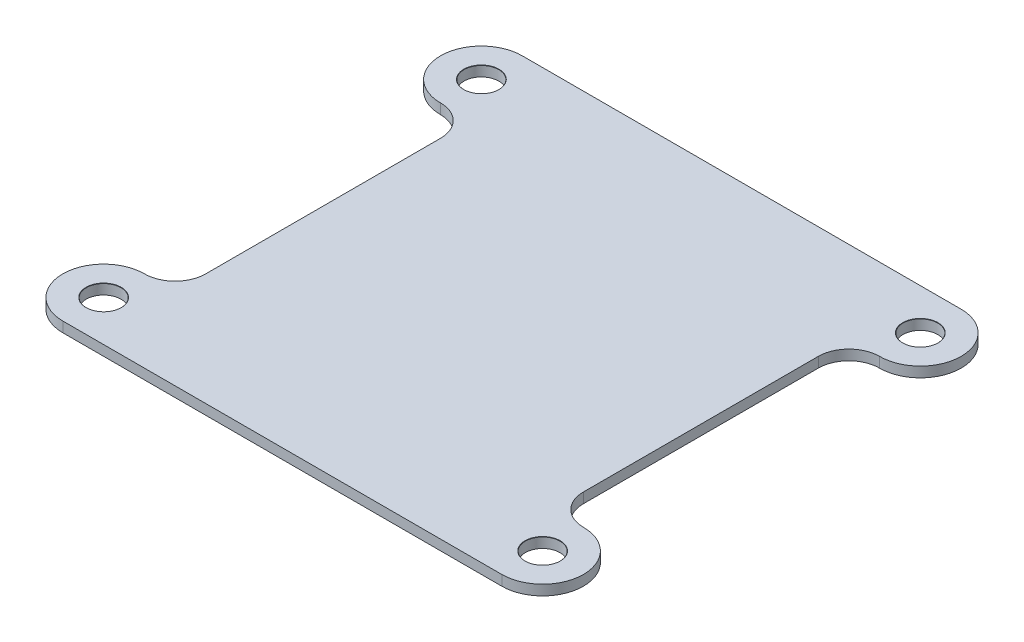
ISO-10303-21;
HEADER;
FILE_DESCRIPTION(('STEP AP214'),'2;1');
FILE_NAME('part.step','',(''),(''),'','','');
FILE_SCHEMA(('AUTOMOTIVE_DESIGN { 1 0 10303 214 1 1 1 1 }'));
ENDSEC;
DATA;
#1=APPLICATION_CONTEXT('core data for automotive mechanical design processes');
#2=APPLICATION_PROTOCOL_DEFINITION('international standard','automotive_design',2000,#1);
#3=PRODUCT_CONTEXT('',#1,'mechanical');
#4=PRODUCT('Part','Part','',(#3));
#5=PRODUCT_RELATED_PRODUCT_CATEGORY('part','',(#4));
#6=PRODUCT_DEFINITION_FORMATION('','',#4);
#7=PRODUCT_DEFINITION_CONTEXT('part definition',#1,'design');
#8=PRODUCT_DEFINITION('design','',#6,#7);
#9=PRODUCT_DEFINITION_SHAPE('','',#8);
#10=(LENGTH_UNIT() NAMED_UNIT(*) SI_UNIT(.MILLI.,.METRE.));
#11=(NAMED_UNIT(*) PLANE_ANGLE_UNIT() SI_UNIT($,.RADIAN.));
#12=(NAMED_UNIT(*) SI_UNIT($,.STERADIAN.) SOLID_ANGLE_UNIT());
#13=UNCERTAINTY_MEASURE_WITH_UNIT(LENGTH_MEASURE(1.E-05),#10,'distance_accuracy_value','');
#14=(GEOMETRIC_REPRESENTATION_CONTEXT(3) GLOBAL_UNCERTAINTY_ASSIGNED_CONTEXT((#13)) GLOBAL_UNIT_ASSIGNED_CONTEXT((#10,
#11,#12)) REPRESENTATION_CONTEXT('',''));
#15=CARTESIAN_POINT('',(0.,0.,0.));
#16=DIRECTION('',(0.,0.,1.));
#17=DIRECTION('',(1.,0.,0.));
#18=AXIS2_PLACEMENT_3D('',#15,#16,#17);
#19=CARTESIAN_POINT('',(-18.5,1.,22.5));
#20=DIRECTION('',(1.,0.,0.));
#21=DIRECTION('',(0.,0.,-1.));
#22=AXIS2_PLACEMENT_3D('',#19,#20,#21);
#23=PLANE('',#22);
#24=DIRECTION('',(0.,0.,1.));
#25=VECTOR('',#24,1.);
#26=CARTESIAN_POINT('',(-18.5,0.,22.5));
#27=LINE('',#26,#25);
#28=CARTESIAN_POINT('',(-18.5,0.,-11.5));
#29=VERTEX_POINT('',#28);
#30=CARTESIAN_POINT('',(-18.5,0.,11.5));
#31=VERTEX_POINT('',#30);
#32=EDGE_CURVE('E212',#29,#31,#27,.T.);
#33=ORIENTED_EDGE('',*,*,#32,.T.);
#34=DIRECTION('',(0.,1.,0.));
#35=VECTOR('',#34,1.);
#36=CARTESIAN_POINT('',(-18.5,1.,11.5));
#37=LINE('',#36,#35);
#38=CARTESIAN_POINT('',(-18.5,1.,11.5));
#39=VERTEX_POINT('',#38);
#40=EDGE_CURVE('E242',#31,#39,#37,.T.);
#41=ORIENTED_EDGE('',*,*,#40,.T.);
#42=DIRECTION('',(0.,0.,1.));
#43=VECTOR('',#42,1.);
#44=CARTESIAN_POINT('',(-18.5,1.,22.5));
#45=LINE('',#44,#43);
#46=CARTESIAN_POINT('',(-18.5,1.,-11.5));
#47=VERTEX_POINT('',#46);
#48=EDGE_CURVE('E213',#47,#39,#45,.T.);
#49=ORIENTED_EDGE('',*,*,#48,.F.);
#50=DIRECTION('',(0.,-1.,0.));
#51=VECTOR('',#50,1.);
#52=CARTESIAN_POINT('',(-18.5,1.,-11.5));
#53=LINE('',#52,#51);
#54=EDGE_CURVE('E226',#47,#29,#53,.T.);
#55=ORIENTED_EDGE('',*,*,#54,.T.);
#56=EDGE_LOOP('',(#33,#41,#49,#55));
#57=FACE_BOUND('',#56,.T.);
#58=ADVANCED_FACE('F43',(#57),#23,.F.);
#59=CARTESIAN_POINT('',(18.5,1.,22.5));
#60=DIRECTION('',(0.,0.,-1.));
#61=DIRECTION('',(-1.,0.,0.));
#62=AXIS2_PLACEMENT_3D('',#59,#60,#61);
#63=PLANE('',#62);
#64=DIRECTION('',(1.,0.,0.));
#65=VECTOR('',#64,1.);
#66=CARTESIAN_POINT('',(18.5,0.,22.5));
#67=LINE('',#66,#65);
#68=CARTESIAN_POINT('',(-21.5,0.,22.5));
#69=VERTEX_POINT('',#68);
#70=CARTESIAN_POINT('',(21.5,0.,22.5));
#71=VERTEX_POINT('',#70);
#72=EDGE_CURVE('E230',#69,#71,#67,.T.);
#73=ORIENTED_EDGE('',*,*,#72,.T.);
#74=DIRECTION('',(0.,-1.,0.));
#75=VECTOR('',#74,1.);
#76=CARTESIAN_POINT('',(21.5,52.6236379965612,22.5));
#77=LINE('',#76,#75);
#78=CARTESIAN_POINT('',(21.5,1.,22.5));
#79=VERTEX_POINT('',#78);
#80=EDGE_CURVE('E194',#79,#71,#77,.T.);
#81=ORIENTED_EDGE('',*,*,#80,.F.);
#82=DIRECTION('',(1.,0.,0.));
#83=VECTOR('',#82,1.);
#84=CARTESIAN_POINT('',(18.5,1.,22.5));
#85=LINE('',#84,#83);
#86=CARTESIAN_POINT('',(-21.5,1.,22.5));
#87=VERTEX_POINT('',#86);
#88=EDGE_CURVE('E217',#87,#79,#85,.T.);
#89=ORIENTED_EDGE('',*,*,#88,.F.);
#90=DIRECTION('',(0.,-1.,0.));
#91=VECTOR('',#90,1.);
#92=CARTESIAN_POINT('',(-21.5,52.6236379965612,22.5));
#93=LINE('',#92,#91);
#94=EDGE_CURVE('E186',#87,#69,#93,.T.);
#95=ORIENTED_EDGE('',*,*,#94,.T.);
#96=EDGE_LOOP('',(#73,#81,#89,#95));
#97=FACE_BOUND('',#96,.T.);
#98=ADVANCED_FACE('F281',(#97),#63,.F.);
#99=CARTESIAN_POINT('',(18.5,1.,22.5));
#100=DIRECTION('',(-1.,0.,0.));
#101=DIRECTION('',(0.,0.,1.));
#102=AXIS2_PLACEMENT_3D('',#99,#100,#101);
#103=PLANE('',#102);
#104=DIRECTION('',(0.,0.,-1.));
#105=VECTOR('',#104,1.);
#106=CARTESIAN_POINT('',(18.5,0.,22.5));
#107=LINE('',#106,#105);
#108=CARTESIAN_POINT('',(18.5,0.,11.5));
#109=VERTEX_POINT('',#108);
#110=CARTESIAN_POINT('',(18.5,0.,-11.5));
#111=VERTEX_POINT('',#110);
#112=EDGE_CURVE('E233',#109,#111,#107,.T.);
#113=ORIENTED_EDGE('',*,*,#112,.T.);
#114=DIRECTION('',(0.,1.,0.));
#115=VECTOR('',#114,1.);
#116=CARTESIAN_POINT('',(18.5,1.,-11.5));
#117=LINE('',#116,#115);
#118=CARTESIAN_POINT('',(18.5,1.,-11.5));
#119=VERTEX_POINT('',#118);
#120=EDGE_CURVE('E250',#111,#119,#117,.T.);
#121=ORIENTED_EDGE('',*,*,#120,.T.);
#122=DIRECTION('',(0.,0.,-1.));
#123=VECTOR('',#122,1.);
#124=CARTESIAN_POINT('',(18.5,1.,22.5));
#125=LINE('',#124,#123);
#126=CARTESIAN_POINT('',(18.5,1.,11.5));
#127=VERTEX_POINT('',#126);
#128=EDGE_CURVE('E135',#127,#119,#125,.T.);
#129=ORIENTED_EDGE('',*,*,#128,.F.);
#130=DIRECTION('',(0.,-1.,0.));
#131=VECTOR('',#130,1.);
#132=CARTESIAN_POINT('',(18.5,1.,11.5));
#133=LINE('',#132,#131);
#134=EDGE_CURVE('E246',#127,#109,#133,.T.);
#135=ORIENTED_EDGE('',*,*,#134,.T.);
#136=EDGE_LOOP('',(#113,#121,#129,#135));
#137=FACE_BOUND('',#136,.T.);
#138=ADVANCED_FACE('F278',(#137),#103,.F.);
#139=CARTESIAN_POINT('',(18.5,1.,-22.5));
#140=DIRECTION('',(0.,0.,1.));
#141=DIRECTION('',(1.,0.,0.));
#142=AXIS2_PLACEMENT_3D('',#139,#140,#141);
#143=PLANE('',#142);
#144=DIRECTION('',(-1.,0.,0.));
#145=VECTOR('',#144,1.);
#146=CARTESIAN_POINT('',(18.5,0.,-22.5));
#147=LINE('',#146,#145);
#148=CARTESIAN_POINT('',(21.5,0.,-22.5));
#149=VERTEX_POINT('',#148);
#150=CARTESIAN_POINT('',(-21.5,0.,-22.5));
#151=VERTEX_POINT('',#150);
#152=EDGE_CURVE('E218',#149,#151,#147,.T.);
#153=ORIENTED_EDGE('',*,*,#152,.T.);
#154=DIRECTION('',(0.,-1.,0.));
#155=VECTOR('',#154,1.);
#156=CARTESIAN_POINT('',(-21.5,52.6236379965612,-22.5));
#157=LINE('',#156,#155);
#158=CARTESIAN_POINT('',(-21.5,1.,-22.5));
#159=VERTEX_POINT('',#158);
#160=EDGE_CURVE('E166',#159,#151,#157,.T.);
#161=ORIENTED_EDGE('',*,*,#160,.F.);
#162=DIRECTION('',(-1.,0.,0.));
#163=VECTOR('',#162,1.);
#164=CARTESIAN_POINT('',(18.5,1.,-22.5));
#165=LINE('',#164,#163);
#166=CARTESIAN_POINT('',(21.5,1.,-22.5));
#167=VERTEX_POINT('',#166);
#168=EDGE_CURVE('E223',#167,#159,#165,.T.);
#169=ORIENTED_EDGE('',*,*,#168,.F.);
#170=DIRECTION('',(0.,-1.,0.));
#171=VECTOR('',#170,1.);
#172=CARTESIAN_POINT('',(21.5,52.6236379965612,-22.5));
#173=LINE('',#172,#171);
#174=EDGE_CURVE('E146',#167,#149,#173,.T.);
#175=ORIENTED_EDGE('',*,*,#174,.T.);
#176=EDGE_LOOP('',(#153,#161,#169,#175));
#177=FACE_BOUND('',#176,.T.);
#178=ADVANCED_FACE('F280',(#177),#143,.F.);
#179=CARTESIAN_POINT('',(0.,1.,0.));
#180=DIRECTION('',(0.,1.,0.));
#181=DIRECTION('',(0.,0.,1.));
#182=AXIS2_PLACEMENT_3D('',#179,#180,#181);
#183=PLANE('',#182);
#184=CARTESIAN_POINT('',(-21.5,1.,-18.5));
#185=DIRECTION('',(0.,1.,0.));
#186=DIRECTION('',(0.,0.,1.));
#187=AXIS2_PLACEMENT_3D('',#184,#185,#186);
#188=CIRCLE('',#187,1.725);
#189=CARTESIAN_POINT('',(-21.5,1.,-16.775));
#190=VERTEX_POINT('',#189);
#191=EDGE_CURVE('E394',#190,#190,#188,.T.);
#192=ORIENTED_EDGE('',*,*,#191,.F.);
#193=EDGE_LOOP('',(#192));
#194=FACE_BOUND('',#193,.T.);
#195=CARTESIAN_POINT('',(-21.5,1.,18.5));
#196=DIRECTION('',(0.,1.,0.));
#197=DIRECTION('',(0.,0.,1.));
#198=AXIS2_PLACEMENT_3D('',#195,#196,#197);
#199=CIRCLE('',#198,1.725);
#200=CARTESIAN_POINT('',(-21.5,1.,20.225));
#201=VERTEX_POINT('',#200);
#202=EDGE_CURVE('E384',#201,#201,#199,.T.);
#203=ORIENTED_EDGE('',*,*,#202,.F.);
#204=EDGE_LOOP('',(#203));
#205=FACE_BOUND('',#204,.T.);
#206=CARTESIAN_POINT('',(21.5,1.,18.5));
#207=DIRECTION('',(0.,1.,0.));
#208=DIRECTION('',(0.,0.,1.));
#209=AXIS2_PLACEMENT_3D('',#206,#207,#208);
#210=CIRCLE('',#209,1.725);
#211=CARTESIAN_POINT('',(21.5,1.,20.225));
#212=VERTEX_POINT('',#211);
#213=EDGE_CURVE('E366',#212,#212,#210,.T.);
#214=ORIENTED_EDGE('',*,*,#213,.F.);
#215=EDGE_LOOP('',(#214));
#216=FACE_BOUND('',#215,.T.);
#217=CARTESIAN_POINT('',(21.5,1.,-18.5));
#218=DIRECTION('',(0.,1.,0.));
#219=DIRECTION('',(0.,0.,1.));
#220=AXIS2_PLACEMENT_3D('',#217,#218,#219);
#221=CIRCLE('',#220,1.725);
#222=CARTESIAN_POINT('',(21.5,1.,-16.775));
#223=VERTEX_POINT('',#222);
#224=EDGE_CURVE('E358',#223,#223,#221,.T.);
#225=ORIENTED_EDGE('',*,*,#224,.F.);
#226=EDGE_LOOP('',(#225));
#227=FACE_BOUND('',#226,.T.);
#228=CARTESIAN_POINT('',(21.5,1.,18.5));
#229=DIRECTION('',(0.,1.,0.));
#230=DIRECTION('',(0.,0.,1.));
#231=AXIS2_PLACEMENT_3D('',#228,#229,#230);
#232=CIRCLE('',#231,4.);
#233=CARTESIAN_POINT('',(21.5,1.,14.5));
#234=VERTEX_POINT('',#233);
#235=EDGE_CURVE('E190',#234,#79,#232,.F.);
#236=ORIENTED_EDGE('',*,*,#235,.F.);
#237=CARTESIAN_POINT('',(21.5,1.,11.5));
#238=DIRECTION('',(0.,1.,0.));
#239=DIRECTION('',(0.,0.,1.));
#240=AXIS2_PLACEMENT_3D('',#237,#238,#239);
#241=CIRCLE('',#240,3.);
#242=EDGE_CURVE('E11',#234,#127,#241,.F.);
#243=ORIENTED_EDGE('',*,*,#242,.T.);
#244=ORIENTED_EDGE('',*,*,#128,.T.);
#245=CARTESIAN_POINT('',(21.5,1.,-11.5));
#246=DIRECTION('',(0.,1.,0.));
#247=DIRECTION('',(0.,0.,1.));
#248=AXIS2_PLACEMENT_3D('',#245,#246,#247);
#249=CIRCLE('',#248,3.);
#250=CARTESIAN_POINT('',(21.5,1.,-14.5));
#251=VERTEX_POINT('',#250);
#252=EDGE_CURVE('E59',#119,#251,#249,.F.);
#253=ORIENTED_EDGE('',*,*,#252,.T.);
#254=CARTESIAN_POINT('',(21.5,1.,-18.5));
#255=DIRECTION('',(0.,1.,0.));
#256=DIRECTION('',(0.,0.,1.));
#257=AXIS2_PLACEMENT_3D('',#254,#255,#256);
#258=CIRCLE('',#257,4.);
#259=EDGE_CURVE('E133',#167,#251,#258,.F.);
#260=ORIENTED_EDGE('',*,*,#259,.F.);
#261=ORIENTED_EDGE('',*,*,#168,.T.);
#262=CARTESIAN_POINT('',(-21.5,1.,-18.5));
#263=DIRECTION('',(0.,1.,0.));
#264=DIRECTION('',(0.,0.,1.));
#265=AXIS2_PLACEMENT_3D('',#262,#263,#264);
#266=CIRCLE('',#265,4.);
#267=CARTESIAN_POINT('',(-21.5,1.,-14.5));
#268=VERTEX_POINT('',#267);
#269=EDGE_CURVE('E165',#268,#159,#266,.F.);
#270=ORIENTED_EDGE('',*,*,#269,.F.);
#271=CARTESIAN_POINT('',(-21.5,1.,-11.5));
#272=DIRECTION('',(0.,1.,0.));
#273=DIRECTION('',(0.,0.,1.));
#274=AXIS2_PLACEMENT_3D('',#271,#272,#273);
#275=CIRCLE('',#274,3.);
#276=EDGE_CURVE('E138',#268,#47,#275,.F.);
#277=ORIENTED_EDGE('',*,*,#276,.T.);
#278=ORIENTED_EDGE('',*,*,#48,.T.);
#279=CARTESIAN_POINT('',(-21.5,1.,11.5));
#280=DIRECTION('',(0.,1.,0.));
#281=DIRECTION('',(0.,0.,1.));
#282=AXIS2_PLACEMENT_3D('',#279,#280,#281);
#283=CIRCLE('',#282,3.);
#284=CARTESIAN_POINT('',(-21.5,1.,14.5));
#285=VERTEX_POINT('',#284);
#286=EDGE_CURVE('E253',#39,#285,#283,.F.);
#287=ORIENTED_EDGE('',*,*,#286,.T.);
#288=CARTESIAN_POINT('',(-21.5,1.,18.5));
#289=DIRECTION('',(0.,1.,0.));
#290=DIRECTION('',(0.,0.,1.));
#291=AXIS2_PLACEMENT_3D('',#288,#289,#290);
#292=CIRCLE('',#291,4.);
#293=EDGE_CURVE('E196',#87,#285,#292,.F.);
#294=ORIENTED_EDGE('',*,*,#293,.F.);
#295=ORIENTED_EDGE('',*,*,#88,.T.);
#296=EDGE_LOOP('',(#236,#243,#244,#253,#260,#261,#270,#277,#278,#287,#294,#295));
#297=FACE_BOUND('',#296,.T.);
#298=ADVANCED_FACE('F132',(#194,#205,#216,#227,#297),#183,.T.);
#299=CARTESIAN_POINT('',(0.,0.,0.));
#300=DIRECTION('',(0.,1.,0.));
#301=DIRECTION('',(0.,0.,1.));
#302=AXIS2_PLACEMENT_3D('',#299,#300,#301);
#303=PLANE('',#302);
#304=CARTESIAN_POINT('',(-21.5,0.,-18.5));
#305=DIRECTION('',(0.,1.,0.));
#306=DIRECTION('',(0.,0.,1.));
#307=AXIS2_PLACEMENT_3D('',#304,#305,#306);
#308=CIRCLE('',#307,1.7);
#309=CARTESIAN_POINT('',(-21.5,0.,-16.8));
#310=VERTEX_POINT('',#309);
#311=EDGE_CURVE('E347',#310,#310,#308,.T.);
#312=ORIENTED_EDGE('',*,*,#311,.T.);
#313=EDGE_LOOP('',(#312));
#314=FACE_BOUND('',#313,.T.);
#315=CARTESIAN_POINT('',(-21.5,0.,18.5));
#316=DIRECTION('',(0.,1.,0.));
#317=DIRECTION('',(0.,0.,1.));
#318=AXIS2_PLACEMENT_3D('',#315,#316,#317);
#319=CIRCLE('',#318,1.7);
#320=CARTESIAN_POINT('',(-21.5,0.,20.2));
#321=VERTEX_POINT('',#320);
#322=EDGE_CURVE('E351',#321,#321,#319,.T.);
#323=ORIENTED_EDGE('',*,*,#322,.T.);
#324=EDGE_LOOP('',(#323));
#325=FACE_BOUND('',#324,.T.);
#326=CARTESIAN_POINT('',(21.5,0.,18.5));
#327=DIRECTION('',(0.,1.,0.));
#328=DIRECTION('',(0.,0.,1.));
#329=AXIS2_PLACEMENT_3D('',#326,#327,#328);
#330=CIRCLE('',#329,1.7);
#331=CARTESIAN_POINT('',(21.5,0.,20.2));
#332=VERTEX_POINT('',#331);
#333=EDGE_CURVE('E355',#332,#332,#330,.T.);
#334=ORIENTED_EDGE('',*,*,#333,.T.);
#335=EDGE_LOOP('',(#334));
#336=FACE_BOUND('',#335,.T.);
#337=CARTESIAN_POINT('',(21.5,0.,-18.5));
#338=DIRECTION('',(0.,1.,0.));
#339=DIRECTION('',(0.,0.,1.));
#340=AXIS2_PLACEMENT_3D('',#337,#338,#339);
#341=CIRCLE('',#340,1.7);
#342=CARTESIAN_POINT('',(21.5,0.,-16.8));
#343=VERTEX_POINT('',#342);
#344=EDGE_CURVE('E152',#343,#343,#341,.T.);
#345=ORIENTED_EDGE('',*,*,#344,.T.);
#346=EDGE_LOOP('',(#345));
#347=FACE_BOUND('',#346,.T.);
#348=ORIENTED_EDGE('',*,*,#32,.F.);
#349=CARTESIAN_POINT('',(-21.5,0.,-11.5));
#350=DIRECTION('',(0.,1.,0.));
#351=DIRECTION('',(0.,0.,1.));
#352=AXIS2_PLACEMENT_3D('',#349,#350,#351);
#353=CIRCLE('',#352,3.);
#354=CARTESIAN_POINT('',(-21.5,0.,-14.5));
#355=VERTEX_POINT('',#354);
#356=EDGE_CURVE('E259',#29,#355,#353,.T.);
#357=ORIENTED_EDGE('',*,*,#356,.T.);
#358=CARTESIAN_POINT('',(-21.5,0.,-18.5));
#359=DIRECTION('',(0.,-1.,0.));
#360=DIRECTION('',(0.,0.,1.));
#361=AXIS2_PLACEMENT_3D('',#358,#359,#360);
#362=CIRCLE('',#361,4.);
#363=EDGE_CURVE('E164',#355,#151,#362,.T.);
#364=ORIENTED_EDGE('',*,*,#363,.T.);
#365=ORIENTED_EDGE('',*,*,#152,.F.);
#366=CARTESIAN_POINT('',(21.5,0.,-18.5));
#367=DIRECTION('',(0.,-1.,0.));
#368=DIRECTION('',(0.,0.,1.));
#369=AXIS2_PLACEMENT_3D('',#366,#367,#368);
#370=CIRCLE('',#369,4.);
#371=CARTESIAN_POINT('',(21.5,0.,-14.5));
#372=VERTEX_POINT('',#371);
#373=EDGE_CURVE('E175',#149,#372,#370,.T.);
#374=ORIENTED_EDGE('',*,*,#373,.T.);
#375=CARTESIAN_POINT('',(21.5,0.,-11.5));
#376=DIRECTION('',(0.,1.,0.));
#377=DIRECTION('',(0.,0.,1.));
#378=AXIS2_PLACEMENT_3D('',#375,#376,#377);
#379=CIRCLE('',#378,3.);
#380=EDGE_CURVE('E137',#372,#111,#379,.T.);
#381=ORIENTED_EDGE('',*,*,#380,.T.);
#382=ORIENTED_EDGE('',*,*,#112,.F.);
#383=CARTESIAN_POINT('',(21.5,0.,11.5));
#384=DIRECTION('',(0.,1.,0.));
#385=DIRECTION('',(0.,0.,1.));
#386=AXIS2_PLACEMENT_3D('',#383,#384,#385);
#387=CIRCLE('',#386,3.);
#388=CARTESIAN_POINT('',(21.5,0.,14.5));
#389=VERTEX_POINT('',#388);
#390=EDGE_CURVE('E52',#109,#389,#387,.T.);
#391=ORIENTED_EDGE('',*,*,#390,.T.);
#392=CARTESIAN_POINT('',(21.5,0.,18.5));
#393=DIRECTION('',(0.,-1.,0.));
#394=DIRECTION('',(0.,0.,-1.));
#395=AXIS2_PLACEMENT_3D('',#392,#393,#394);
#396=CIRCLE('',#395,4.);
#397=EDGE_CURVE('E178',#389,#71,#396,.T.);
#398=ORIENTED_EDGE('',*,*,#397,.T.);
#399=ORIENTED_EDGE('',*,*,#72,.F.);
#400=CARTESIAN_POINT('',(-21.5,0.,18.5));
#401=DIRECTION('',(0.,-1.,0.));
#402=DIRECTION('',(0.,0.,-1.));
#403=AXIS2_PLACEMENT_3D('',#400,#401,#402);
#404=CIRCLE('',#403,4.);
#405=CARTESIAN_POINT('',(-21.5,0.,14.5));
#406=VERTEX_POINT('',#405);
#407=EDGE_CURVE('E182',#69,#406,#404,.T.);
#408=ORIENTED_EDGE('',*,*,#407,.T.);
#409=CARTESIAN_POINT('',(-21.5,0.,11.5));
#410=DIRECTION('',(0.,1.,0.));
#411=DIRECTION('',(0.,0.,1.));
#412=AXIS2_PLACEMENT_3D('',#409,#410,#411);
#413=CIRCLE('',#412,3.);
#414=EDGE_CURVE('E256',#406,#31,#413,.T.);
#415=ORIENTED_EDGE('',*,*,#414,.T.);
#416=EDGE_LOOP('',(#348,#357,#364,#365,#374,#381,#382,#391,#398,#399,#408,#415));
#417=FACE_BOUND('',#416,.T.);
#418=ADVANCED_FACE('F270',(#314,#325,#336,#347,#417),#303,.F.);
#419=CARTESIAN_POINT('',(21.5,52.6236379965612,18.5));
#420=DIRECTION('',(0.,-1.,0.));
#421=DIRECTION('',(0.,0.,-1.));
#422=AXIS2_PLACEMENT_3D('',#419,#420,#421);
#423=CYLINDRICAL_SURFACE('',#422,4.);
#424=DIRECTION('',(0.,-1.,0.));
#425=VECTOR('',#424,1.);
#426=CARTESIAN_POINT('',(21.5,52.6236379965612,14.5));
#427=LINE('',#426,#425);
#428=EDGE_CURVE('E195',#234,#389,#427,.T.);
#429=ORIENTED_EDGE('',*,*,#428,.F.);
#430=ORIENTED_EDGE('',*,*,#235,.T.);
#431=ORIENTED_EDGE('',*,*,#80,.T.);
#432=ORIENTED_EDGE('',*,*,#397,.F.);
#433=EDGE_LOOP('',(#429,#430,#431,#432));
#434=FACE_BOUND('',#433,.T.);
#435=ADVANCED_FACE('F275',(#434),#423,.T.);
#436=CARTESIAN_POINT('',(-21.5,52.6236379965612,18.5));
#437=DIRECTION('',(0.,-1.,0.));
#438=DIRECTION('',(0.,0.,-1.));
#439=AXIS2_PLACEMENT_3D('',#436,#437,#438);
#440=CYLINDRICAL_SURFACE('',#439,4.);
#441=ORIENTED_EDGE('',*,*,#94,.F.);
#442=ORIENTED_EDGE('',*,*,#293,.T.);
#443=DIRECTION('',(0.,-1.,0.));
#444=VECTOR('',#443,1.);
#445=CARTESIAN_POINT('',(-21.5,52.6236379965612,14.5));
#446=LINE('',#445,#444);
#447=EDGE_CURVE('E200',#285,#406,#446,.T.);
#448=ORIENTED_EDGE('',*,*,#447,.T.);
#449=ORIENTED_EDGE('',*,*,#407,.F.);
#450=EDGE_LOOP('',(#441,#442,#448,#449));
#451=FACE_BOUND('',#450,.T.);
#452=ADVANCED_FACE('F331',(#451),#440,.T.);
#453=CARTESIAN_POINT('',(21.5,52.6236379965612,-18.5));
#454=DIRECTION('',(0.,-1.,0.));
#455=DIRECTION('',(0.,0.,-1.));
#456=AXIS2_PLACEMENT_3D('',#453,#454,#455);
#457=CYLINDRICAL_SURFACE('',#456,4.);
#458=ORIENTED_EDGE('',*,*,#174,.F.);
#459=ORIENTED_EDGE('',*,*,#259,.T.);
#460=DIRECTION('',(0.,-1.,0.));
#461=VECTOR('',#460,1.);
#462=CARTESIAN_POINT('',(21.5,52.6236379965612,-14.5));
#463=LINE('',#462,#461);
#464=EDGE_CURVE('E143',#251,#372,#463,.T.);
#465=ORIENTED_EDGE('',*,*,#464,.T.);
#466=ORIENTED_EDGE('',*,*,#373,.F.);
#467=EDGE_LOOP('',(#458,#459,#465,#466));
#468=FACE_BOUND('',#467,.T.);
#469=ADVANCED_FACE('F141',(#468),#457,.T.);
#470=CARTESIAN_POINT('',(-21.5,52.6236379965612,-18.5));
#471=DIRECTION('',(0.,-1.,0.));
#472=DIRECTION('',(0.,0.,-1.));
#473=AXIS2_PLACEMENT_3D('',#470,#471,#472);
#474=CYLINDRICAL_SURFACE('',#473,4.);
#475=DIRECTION('',(0.,-1.,0.));
#476=VECTOR('',#475,1.);
#477=CARTESIAN_POINT('',(-21.5,52.6236379965612,-14.5));
#478=LINE('',#477,#476);
#479=EDGE_CURVE('E160',#268,#355,#478,.T.);
#480=ORIENTED_EDGE('',*,*,#479,.F.);
#481=ORIENTED_EDGE('',*,*,#269,.T.);
#482=ORIENTED_EDGE('',*,*,#160,.T.);
#483=ORIENTED_EDGE('',*,*,#363,.F.);
#484=EDGE_LOOP('',(#480,#481,#482,#483));
#485=FACE_BOUND('',#484,.T.);
#486=ADVANCED_FACE('F301',(#485),#474,.T.);
#487=CARTESIAN_POINT('',(-21.5,1.,11.5));
#488=DIRECTION('',(0.,1.,0.));
#489=DIRECTION('',(0.,0.,1.));
#490=AXIS2_PLACEMENT_3D('',#487,#488,#489);
#491=CYLINDRICAL_SURFACE('',#490,3.);
#492=ORIENTED_EDGE('',*,*,#414,.F.);
#493=ORIENTED_EDGE('',*,*,#447,.F.);
#494=ORIENTED_EDGE('',*,*,#286,.F.);
#495=ORIENTED_EDGE('',*,*,#40,.F.);
#496=EDGE_LOOP('',(#492,#493,#494,#495));
#497=FACE_BOUND('',#496,.T.);
#498=ADVANCED_FACE('F297',(#497),#491,.F.);
#499=CARTESIAN_POINT('',(-21.5,1.,-11.5));
#500=DIRECTION('',(0.,-1.,0.));
#501=DIRECTION('',(0.,0.,-1.));
#502=AXIS2_PLACEMENT_3D('',#499,#500,#501);
#503=CYLINDRICAL_SURFACE('',#502,3.);
#504=ORIENTED_EDGE('',*,*,#276,.F.);
#505=ORIENTED_EDGE('',*,*,#479,.T.);
#506=ORIENTED_EDGE('',*,*,#356,.F.);
#507=ORIENTED_EDGE('',*,*,#54,.F.);
#508=EDGE_LOOP('',(#504,#505,#506,#507));
#509=FACE_BOUND('',#508,.T.);
#510=ADVANCED_FACE('F300',(#509),#503,.F.);
#511=CARTESIAN_POINT('',(21.5,1.,-11.5));
#512=DIRECTION('',(0.,1.,0.));
#513=DIRECTION('',(0.,0.,1.));
#514=AXIS2_PLACEMENT_3D('',#511,#512,#513);
#515=CYLINDRICAL_SURFACE('',#514,3.);
#516=ORIENTED_EDGE('',*,*,#380,.F.);
#517=ORIENTED_EDGE('',*,*,#464,.F.);
#518=ORIENTED_EDGE('',*,*,#252,.F.);
#519=ORIENTED_EDGE('',*,*,#120,.F.);
#520=EDGE_LOOP('',(#516,#517,#518,#519));
#521=FACE_BOUND('',#520,.T.);
#522=ADVANCED_FACE('F150',(#521),#515,.F.);
#523=CARTESIAN_POINT('',(21.5,1.,11.5));
#524=DIRECTION('',(0.,-1.,0.));
#525=DIRECTION('',(0.,0.,-1.));
#526=AXIS2_PLACEMENT_3D('',#523,#524,#525);
#527=CYLINDRICAL_SURFACE('',#526,3.);
#528=ORIENTED_EDGE('',*,*,#242,.F.);
#529=ORIENTED_EDGE('',*,*,#428,.T.);
#530=ORIENTED_EDGE('',*,*,#390,.F.);
#531=ORIENTED_EDGE('',*,*,#134,.F.);
#532=EDGE_LOOP('',(#528,#529,#530,#531));
#533=FACE_BOUND('',#532,.T.);
#534=ADVANCED_FACE('F45',(#533),#527,.F.);
#535=CARTESIAN_POINT('',(21.5,1.,-18.5));
#536=DIRECTION('',(0.,1.,0.));
#537=DIRECTION('',(0.,0.,1.));
#538=AXIS2_PLACEMENT_3D('',#535,#536,#537);
#539=CYLINDRICAL_SURFACE('',#538,1.7);
#540=ORIENTED_EDGE('',*,*,#344,.F.);
#541=EDGE_LOOP('',(#540));
#542=FACE_BOUND('',#541,.T.);
#543=CARTESIAN_POINT('',(21.5,0.974999999999998,-18.5));
#544=DIRECTION('',(0.,1.,0.));
#545=DIRECTION('',(0.,0.,1.));
#546=AXIS2_PLACEMENT_3D('',#543,#544,#545);
#547=CIRCLE('',#546,1.7);
#548=CARTESIAN_POINT('',(21.5,0.974999999999998,-16.8));
#549=VERTEX_POINT('',#548);
#550=EDGE_CURVE('E156',#549,#549,#547,.T.);
#551=ORIENTED_EDGE('',*,*,#550,.T.);
#552=EDGE_LOOP('',(#551));
#553=FACE_BOUND('',#552,.T.);
#554=ADVANCED_FACE('F309',(#542,#553),#539,.F.);
#555=CARTESIAN_POINT('',(21.5,1.,-18.5));
#556=DIRECTION('',(0.,1.,0.));
#557=DIRECTION('',(0.,0.,1.));
#558=AXIS2_PLACEMENT_3D('',#555,#556,#557);
#559=CONICAL_SURFACE('',#558,1.725,0.785398163397427);
#560=ORIENTED_EDGE('',*,*,#550,.F.);
#561=EDGE_LOOP('',(#560));
#562=FACE_BOUND('',#561,.T.);
#563=ORIENTED_EDGE('',*,*,#224,.T.);
#564=EDGE_LOOP('',(#563));
#565=FACE_BOUND('',#564,.T.);
#566=ADVANCED_FACE('F313',(#562,#565),#559,.F.);
#567=CARTESIAN_POINT('',(21.5,1.,18.5));
#568=DIRECTION('',(0.,1.,0.));
#569=DIRECTION('',(0.,0.,1.));
#570=AXIS2_PLACEMENT_3D('',#567,#568,#569);
#571=CYLINDRICAL_SURFACE('',#570,1.7);
#572=ORIENTED_EDGE('',*,*,#333,.F.);
#573=EDGE_LOOP('',(#572));
#574=FACE_BOUND('',#573,.T.);
#575=CARTESIAN_POINT('',(21.5,0.974999999999998,18.5));
#576=DIRECTION('',(0.,1.,0.));
#577=DIRECTION('',(0.,0.,1.));
#578=AXIS2_PLACEMENT_3D('',#575,#576,#577);
#579=CIRCLE('',#578,1.7);
#580=CARTESIAN_POINT('',(21.5,0.974999999999998,20.2));
#581=VERTEX_POINT('',#580);
#582=EDGE_CURVE('E359',#581,#581,#579,.T.);
#583=ORIENTED_EDGE('',*,*,#582,.T.);
#584=EDGE_LOOP('',(#583));
#585=FACE_BOUND('',#584,.T.);
#586=ADVANCED_FACE('F319',(#574,#585),#571,.F.);
#587=CARTESIAN_POINT('',(21.5,1.,18.5));
#588=DIRECTION('',(0.,1.,0.));
#589=DIRECTION('',(0.,0.,1.));
#590=AXIS2_PLACEMENT_3D('',#587,#588,#589);
#591=CONICAL_SURFACE('',#590,1.725,0.785398163397427);
#592=ORIENTED_EDGE('',*,*,#582,.F.);
#593=EDGE_LOOP('',(#592));
#594=FACE_BOUND('',#593,.T.);
#595=ORIENTED_EDGE('',*,*,#213,.T.);
#596=EDGE_LOOP('',(#595));
#597=FACE_BOUND('',#596,.T.);
#598=ADVANCED_FACE('F405',(#594,#597),#591,.F.);
#599=CARTESIAN_POINT('',(-21.5,1.,18.5));
#600=DIRECTION('',(0.,1.,0.));
#601=DIRECTION('',(0.,0.,1.));
#602=AXIS2_PLACEMENT_3D('',#599,#600,#601);
#603=CYLINDRICAL_SURFACE('',#602,1.7);
#604=ORIENTED_EDGE('',*,*,#322,.F.);
#605=EDGE_LOOP('',(#604));
#606=FACE_BOUND('',#605,.T.);
#607=CARTESIAN_POINT('',(-21.5,0.974999999999998,18.5));
#608=DIRECTION('',(0.,1.,0.));
#609=DIRECTION('',(0.,0.,1.));
#610=AXIS2_PLACEMENT_3D('',#607,#608,#609);
#611=CIRCLE('',#610,1.7);
#612=CARTESIAN_POINT('',(-21.5,0.974999999999998,20.2));
#613=VERTEX_POINT('',#612);
#614=EDGE_CURVE('E380',#613,#613,#611,.T.);
#615=ORIENTED_EDGE('',*,*,#614,.T.);
#616=EDGE_LOOP('',(#615));
#617=FACE_BOUND('',#616,.T.);
#618=ADVANCED_FACE('F407',(#606,#617),#603,.F.);
#619=CARTESIAN_POINT('',(-21.5,1.,18.5));
#620=DIRECTION('',(0.,1.,0.));
#621=DIRECTION('',(0.,0.,1.));
#622=AXIS2_PLACEMENT_3D('',#619,#620,#621);
#623=CONICAL_SURFACE('',#622,1.725,0.785398163397427);
#624=ORIENTED_EDGE('',*,*,#614,.F.);
#625=EDGE_LOOP('',(#624));
#626=FACE_BOUND('',#625,.T.);
#627=ORIENTED_EDGE('',*,*,#202,.T.);
#628=EDGE_LOOP('',(#627));
#629=FACE_BOUND('',#628,.T.);
#630=ADVANCED_FACE('F414',(#626,#629),#623,.F.);
#631=CARTESIAN_POINT('',(-21.5,1.,-18.5));
#632=DIRECTION('',(0.,1.,0.));
#633=DIRECTION('',(0.,0.,1.));
#634=AXIS2_PLACEMENT_3D('',#631,#632,#633);
#635=CYLINDRICAL_SURFACE('',#634,1.7);
#636=ORIENTED_EDGE('',*,*,#311,.F.);
#637=EDGE_LOOP('',(#636));
#638=FACE_BOUND('',#637,.T.);
#639=CARTESIAN_POINT('',(-21.5,0.974999999999998,-18.5));
#640=DIRECTION('',(0.,1.,0.));
#641=DIRECTION('',(0.,0.,1.));
#642=AXIS2_PLACEMENT_3D('',#639,#640,#641);
#643=CIRCLE('',#642,1.7);
#644=CARTESIAN_POINT('',(-21.5,0.974999999999998,-16.8));
#645=VERTEX_POINT('',#644);
#646=EDGE_CURVE('E390',#645,#645,#643,.T.);
#647=ORIENTED_EDGE('',*,*,#646,.T.);
#648=EDGE_LOOP('',(#647));
#649=FACE_BOUND('',#648,.T.);
#650=ADVANCED_FACE('F421',(#638,#649),#635,.F.);
#651=CARTESIAN_POINT('',(-21.5,1.,-18.5));
#652=DIRECTION('',(0.,1.,0.));
#653=DIRECTION('',(0.,0.,1.));
#654=AXIS2_PLACEMENT_3D('',#651,#652,#653);
#655=CONICAL_SURFACE('',#654,1.725,0.785398163397427);
#656=ORIENTED_EDGE('',*,*,#646,.F.);
#657=EDGE_LOOP('',(#656));
#658=FACE_BOUND('',#657,.T.);
#659=ORIENTED_EDGE('',*,*,#191,.T.);
#660=EDGE_LOOP('',(#659));
#661=FACE_BOUND('',#660,.T.);
#662=ADVANCED_FACE('F399',(#658,#661),#655,.F.);
#663=CLOSED_SHELL('',(#58,#98,#138,#178,#298,#418,#435,#452,#469,#486,#498,#510,#522,#534,#554,
#566,#586,#598,#618,#630,#650,#662));
#664=MANIFOLD_SOLID_BREP('B2',#663);
#665=ADVANCED_BREP_SHAPE_REPRESENTATION('',(#18,#664),#14);
#666=SHAPE_DEFINITION_REPRESENTATION(#9,#665);
ENDSEC;
END-ISO-10303-21;
